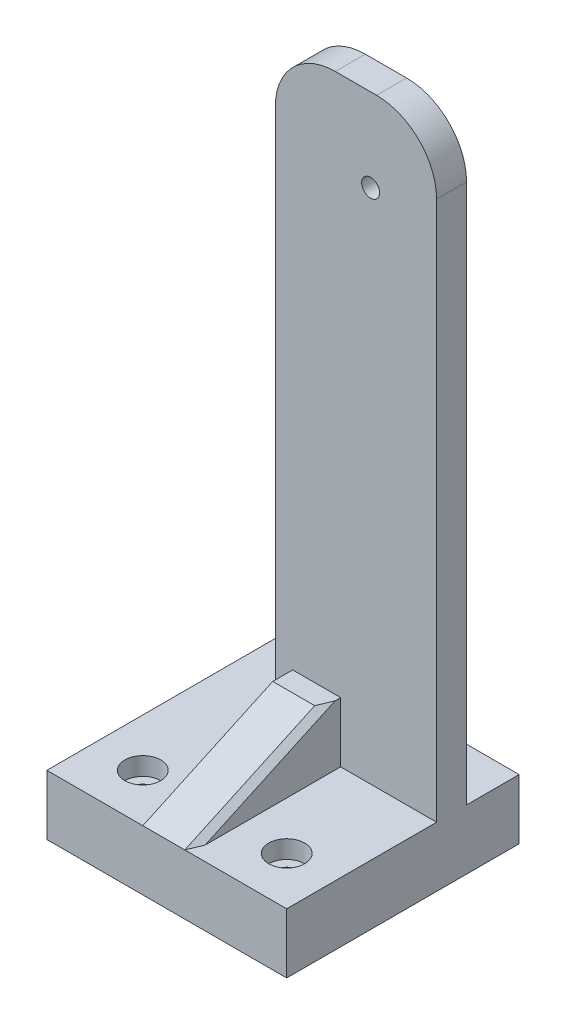
ISO-10303-21;
HEADER;
FILE_DESCRIPTION(('STEP AP214'),'2;1');
FILE_NAME('part.step','',(''),(''),'','','');
FILE_SCHEMA(('AUTOMOTIVE_DESIGN { 1 0 10303 214 1 1 1 1 }'));
ENDSEC;
DATA;
#1=APPLICATION_CONTEXT('core data for automotive mechanical design processes');
#2=APPLICATION_PROTOCOL_DEFINITION('international standard','automotive_design',2000,#1);
#3=PRODUCT_CONTEXT('',#1,'mechanical');
#4=PRODUCT('Part','Part','',(#3));
#5=PRODUCT_RELATED_PRODUCT_CATEGORY('part','',(#4));
#6=PRODUCT_DEFINITION_FORMATION('','',#4);
#7=PRODUCT_DEFINITION_CONTEXT('part definition',#1,'design');
#8=PRODUCT_DEFINITION('design','',#6,#7);
#9=PRODUCT_DEFINITION_SHAPE('','',#8);
#10=(LENGTH_UNIT() NAMED_UNIT(*) SI_UNIT(.MILLI.,.METRE.));
#11=(NAMED_UNIT(*) PLANE_ANGLE_UNIT() SI_UNIT($,.RADIAN.));
#12=(NAMED_UNIT(*) SI_UNIT($,.STERADIAN.) SOLID_ANGLE_UNIT());
#13=UNCERTAINTY_MEASURE_WITH_UNIT(LENGTH_MEASURE(1.E-05),#10,'distance_accuracy_value','');
#14=(GEOMETRIC_REPRESENTATION_CONTEXT(3) GLOBAL_UNCERTAINTY_ASSIGNED_CONTEXT((#13)) GLOBAL_UNIT_ASSIGNED_CONTEXT((#10,
#11,#12)) REPRESENTATION_CONTEXT('',''));
#15=CARTESIAN_POINT('',(0.,0.,0.));
#16=DIRECTION('',(0.,0.,1.));
#17=DIRECTION('',(1.,0.,0.));
#18=AXIS2_PLACEMENT_3D('',#15,#16,#17);
#19=CARTESIAN_POINT('',(-12.,-10.,-23.));
#20=DIRECTION('',(0.,1.,0.));
#21=DIRECTION('',(0.,0.,1.));
#22=AXIS2_PLACEMENT_3D('',#19,#20,#21);
#23=CYLINDRICAL_SURFACE('',#22,1.42);
#24=CARTESIAN_POINT('',(-12.,0.,-23.));
#25=DIRECTION('',(0.,1.,0.));
#26=DIRECTION('',(0.,0.,1.));
#27=AXIS2_PLACEMENT_3D('',#24,#25,#26);
#28=CIRCLE('',#27,1.42);
#29=CARTESIAN_POINT('',(-12.,0.,-21.58));
#30=VERTEX_POINT('',#29);
#31=EDGE_CURVE('E332',#30,#30,#28,.T.);
#32=ORIENTED_EDGE('',*,*,#31,.F.);
#33=EDGE_LOOP('',(#32));
#34=FACE_BOUND('',#33,.T.);
#35=CARTESIAN_POINT('',(-12.,7.,-23.));
#36=DIRECTION('',(0.,1.,0.));
#37=DIRECTION('',(0.,0.,1.));
#38=AXIS2_PLACEMENT_3D('',#35,#36,#37);
#39=CIRCLE('',#38,1.42);
#40=CARTESIAN_POINT('',(-12.,7.,-21.58));
#41=VERTEX_POINT('',#40);
#42=EDGE_CURVE('E344',#41,#41,#39,.F.);
#43=ORIENTED_EDGE('',*,*,#42,.F.);
#44=EDGE_LOOP('',(#43));
#45=FACE_BOUND('',#44,.T.);
#46=ADVANCED_FACE('F39',(#34,#45),#23,.F.);
#47=CARTESIAN_POINT('',(12.,-10.,7.));
#48=DIRECTION('',(0.,1.,0.));
#49=DIRECTION('',(0.,0.,1.));
#50=AXIS2_PLACEMENT_3D('',#47,#48,#49);
#51=CYLINDRICAL_SURFACE('',#50,1.42);
#52=CARTESIAN_POINT('',(12.,0.,7.));
#53=DIRECTION('',(0.,1.,0.));
#54=DIRECTION('',(0.,0.,1.));
#55=AXIS2_PLACEMENT_3D('',#52,#53,#54);
#56=CIRCLE('',#55,1.42);
#57=CARTESIAN_POINT('',(12.,0.,8.42));
#58=VERTEX_POINT('',#57);
#59=EDGE_CURVE('E331',#58,#58,#56,.T.);
#60=ORIENTED_EDGE('',*,*,#59,.F.);
#61=EDGE_LOOP('',(#60));
#62=FACE_BOUND('',#61,.T.);
#63=CARTESIAN_POINT('',(12.,7.,7.));
#64=DIRECTION('',(0.,1.,0.));
#65=DIRECTION('',(0.,0.,1.));
#66=AXIS2_PLACEMENT_3D('',#63,#64,#65);
#67=CIRCLE('',#66,1.42);
#68=CARTESIAN_POINT('',(12.,7.,8.42));
#69=VERTEX_POINT('',#68);
#70=EDGE_CURVE('E341',#69,#69,#67,.F.);
#71=ORIENTED_EDGE('',*,*,#70,.F.);
#72=EDGE_LOOP('',(#71));
#73=FACE_BOUND('',#72,.T.);
#74=ADVANCED_FACE('F520',(#62,#73),#51,.F.);
#75=CARTESIAN_POINT('',(-12.,-10.,7.));
#76=DIRECTION('',(0.,1.,0.));
#77=DIRECTION('',(0.,0.,1.));
#78=AXIS2_PLACEMENT_3D('',#75,#76,#77);
#79=CYLINDRICAL_SURFACE('',#78,1.42);
#80=CARTESIAN_POINT('',(-12.,0.,7.));
#81=DIRECTION('',(0.,1.,0.));
#82=DIRECTION('',(0.,0.,1.));
#83=AXIS2_PLACEMENT_3D('',#80,#81,#82);
#84=CIRCLE('',#83,1.42);
#85=CARTESIAN_POINT('',(-12.,0.,8.42));
#86=VERTEX_POINT('',#85);
#87=EDGE_CURVE('E328',#86,#86,#84,.T.);
#88=ORIENTED_EDGE('',*,*,#87,.F.);
#89=EDGE_LOOP('',(#88));
#90=FACE_BOUND('',#89,.T.);
#91=CARTESIAN_POINT('',(-12.,7.,7.));
#92=DIRECTION('',(0.,1.,0.));
#93=DIRECTION('',(0.,0.,1.));
#94=AXIS2_PLACEMENT_3D('',#91,#92,#93);
#95=CIRCLE('',#94,1.42);
#96=CARTESIAN_POINT('',(-12.,7.,8.42));
#97=VERTEX_POINT('',#96);
#98=EDGE_CURVE('E335',#97,#97,#95,.F.);
#99=ORIENTED_EDGE('',*,*,#98,.F.);
#100=EDGE_LOOP('',(#99));
#101=FACE_BOUND('',#100,.T.);
#102=ADVANCED_FACE('F516',(#90,#101),#79,.F.);
#103=CARTESIAN_POINT('',(0.,10.,0.));
#104=DIRECTION('',(0.,1.,0.));
#105=DIRECTION('',(0.,0.,1.));
#106=AXIS2_PLACEMENT_3D('',#103,#104,#105);
#107=PLANE('',#106);
#108=CARTESIAN_POINT('',(-12.,10.,-23.));
#109=DIRECTION('',(0.,1.,0.));
#110=DIRECTION('',(0.,0.,1.));
#111=AXIS2_PLACEMENT_3D('',#108,#109,#110);
#112=CIRCLE('',#111,3.);
#113=CARTESIAN_POINT('',(-12.,10.,-20.));
#114=VERTEX_POINT('',#113);
#115=EDGE_CURVE('E481',#114,#114,#112,.T.);
#116=ORIENTED_EDGE('',*,*,#115,.F.);
#117=EDGE_LOOP('',(#116));
#118=FACE_BOUND('',#117,.T.);
#119=CARTESIAN_POINT('',(-12.,10.,7.));
#120=DIRECTION('',(0.,1.,0.));
#121=DIRECTION('',(0.,0.,1.));
#122=AXIS2_PLACEMENT_3D('',#119,#120,#121);
#123=CIRCLE('',#122,3.);
#124=CARTESIAN_POINT('',(-12.,10.,10.));
#125=VERTEX_POINT('',#124);
#126=EDGE_CURVE('E348',#125,#125,#123,.T.);
#127=ORIENTED_EDGE('',*,*,#126,.F.);
#128=EDGE_LOOP('',(#127));
#129=FACE_BOUND('',#128,.T.);
#130=DIRECTION('',(1.,0.,0.));
#131=VECTOR('',#130,1.);
#132=CARTESIAN_POINT('',(0.,10.,-15.));
#133=LINE('',#132,#131);
#134=CARTESIAN_POINT('',(-6.88873999040141,10.,-15.));
#135=VERTEX_POINT('',#134);
#136=CARTESIAN_POINT('',(-4.,10.,-15.));
#137=VERTEX_POINT('',#136);
#138=EDGE_CURVE('E227',#135,#137,#133,.T.);
#139=ORIENTED_EDGE('',*,*,#138,.T.);
#140=DIRECTION('',(0.,0.,1.));
#141=VECTOR('',#140,1.);
#142=CARTESIAN_POINT('',(-4.,10.,-15.));
#143=LINE('',#142,#141);
#144=CARTESIAN_POINT('',(-4.,10.,-28.9478603318783));
#145=VERTEX_POINT('',#144);
#146=EDGE_CURVE('E207',#145,#137,#143,.T.);
#147=ORIENTED_EDGE('',*,*,#146,.F.);
#148=DIRECTION('',(-0.688918663769056,0.,0.724838654260835));
#149=VECTOR('',#148,1.);
#150=CARTESIAN_POINT('',(-3.00000000000003,10.,-30.));
#151=LINE('',#150,#149);
#152=CARTESIAN_POINT('',(-3.00000000000003,10.,-30.));
#153=VERTEX_POINT('',#152);
#154=EDGE_CURVE('E381',#145,#153,#151,.F.);
#155=ORIENTED_EDGE('',*,*,#154,.T.);
#156=DIRECTION('',(1.,0.,0.));
#157=VECTOR('',#156,1.);
#158=CARTESIAN_POINT('',(0.,10.,-30.));
#159=LINE('',#158,#157);
#160=CARTESIAN_POINT('',(-20.,10.,-30.));
#161=VERTEX_POINT('',#160);
#162=EDGE_CURVE('E237',#161,#153,#159,.T.);
#163=ORIENTED_EDGE('',*,*,#162,.F.);
#164=DIRECTION('',(0.,0.,-1.));
#165=VECTOR('',#164,1.);
#166=CARTESIAN_POINT('',(-20.,10.,0.));
#167=LINE('',#166,#165);
#168=CARTESIAN_POINT('',(-20.,10.,15.));
#169=VERTEX_POINT('',#168);
#170=EDGE_CURVE('E307',#169,#161,#167,.T.);
#171=ORIENTED_EDGE('',*,*,#170,.F.);
#172=DIRECTION('',(1.,0.,0.));
#173=VECTOR('',#172,1.);
#174=CARTESIAN_POINT('',(0.,10.,15.));
#175=LINE('',#174,#173);
#176=CARTESIAN_POINT('',(-4.,10.,15.));
#177=VERTEX_POINT('',#176);
#178=EDGE_CURVE('E310',#169,#177,#175,.T.);
#179=ORIENTED_EDGE('',*,*,#178,.T.);
#180=DIRECTION('',(0.,0.,1.));
#181=VECTOR('',#180,1.);
#182=CARTESIAN_POINT('',(-4.,10.,-10.));
#183=LINE('',#182,#181);
#184=CARTESIAN_POINT('',(-4.,10.,-10.));
#185=VERTEX_POINT('',#184);
#186=EDGE_CURVE('E261',#185,#177,#183,.T.);
#187=ORIENTED_EDGE('',*,*,#186,.F.);
#188=DIRECTION('',(1.,0.,0.));
#189=VECTOR('',#188,1.);
#190=CARTESIAN_POINT('',(-6.88873999040141,10.,-10.));
#191=LINE('',#190,#189);
#192=CARTESIAN_POINT('',(-6.88873999040141,10.,-10.));
#193=VERTEX_POINT('',#192);
#194=EDGE_CURVE('E289',#193,#185,#191,.T.);
#195=ORIENTED_EDGE('',*,*,#194,.F.);
#196=DIRECTION('',(0.,0.,1.));
#197=VECTOR('',#196,1.);
#198=CARTESIAN_POINT('',(-6.88873999040141,10.,-15.));
#199=LINE('',#198,#197);
#200=EDGE_CURVE('E284',#135,#193,#199,.T.);
#201=ORIENTED_EDGE('',*,*,#200,.F.);
#202=EDGE_LOOP('',(#139,#147,#155,#163,#171,#179,#187,#195,#201));
#203=FACE_BOUND('',#202,.T.);
#204=ADVANCED_FACE('F410',(#118,#129,#203),#107,.T.);
#205=DIRECTION('',(-1.,0.,0.));
#206=VECTOR('',#205,1.);
#207=CARTESIAN_POINT('',(0.,10.,-23.768276438247));
#208=LINE('',#207,#206);
#209=CARTESIAN_POINT('',(20.,10.,-23.768276438247));
#210=VERTEX_POINT('',#209);
#211=CARTESIAN_POINT('',(4.,10.,-23.768276438247));
#212=VERTEX_POINT('',#211);
#213=EDGE_CURVE('E233',#210,#212,#208,.T.);
#214=ORIENTED_EDGE('',*,*,#213,.T.);
#215=DIRECTION('',(0.,0.,-1.));
#216=VECTOR('',#215,1.);
#217=CARTESIAN_POINT('',(4.,10.,-15.));
#218=LINE('',#217,#216);
#219=CARTESIAN_POINT('',(4.,10.,-15.));
#220=VERTEX_POINT('',#219);
#221=EDGE_CURVE('E201',#220,#212,#218,.T.);
#222=ORIENTED_EDGE('',*,*,#221,.F.);
#223=CARTESIAN_POINT('',(20.,10.,-15.));
#224=VERTEX_POINT('',#223);
#225=EDGE_CURVE('E230',#220,#224,#133,.T.);
#226=ORIENTED_EDGE('',*,*,#225,.T.);
#227=DIRECTION('',(0.,0.,-1.));
#228=VECTOR('',#227,1.);
#229=CARTESIAN_POINT('',(20.,10.,0.));
#230=LINE('',#229,#228);
#231=EDGE_CURVE('E231',#224,#210,#230,.T.);
#232=ORIENTED_EDGE('',*,*,#231,.T.);
#233=EDGE_LOOP('',(#214,#222,#226,#232));
#234=FACE_BOUND('',#233,.T.);
#235=ADVANCED_FACE('F461',(#234),#107,.T.);
#236=CARTESIAN_POINT('',(0.,10.,-15.));
#237=DIRECTION('',(0.,0.,-1.));
#238=DIRECTION('',(-1.,0.,0.));
#239=AXIS2_PLACEMENT_3D('',#236,#237,#238);
#240=PLANE('',#239);
#241=CARTESIAN_POINT('',(8.99999999999999,96.14,-15.));
#242=DIRECTION('',(0.,0.,-1.));
#243=DIRECTION('',(-1.,0.,0.));
#244=AXIS2_PLACEMENT_3D('',#241,#242,#243);
#245=CIRCLE('',#244,1.5);
#246=CARTESIAN_POINT('',(7.49999999999999,96.14,-15.));
#247=VERTEX_POINT('',#246);
#248=EDGE_CURVE('E281',#247,#247,#245,.T.);
#249=ORIENTED_EDGE('',*,*,#248,.F.);
#250=EDGE_LOOP('',(#249));
#251=FACE_BOUND('',#250,.T.);
#252=DIRECTION('',(-1.,0.,0.));
#253=VECTOR('',#252,1.);
#254=CARTESIAN_POINT('',(-6.88873999040141,110.,-15.));
#255=LINE('',#254,#253);
#256=CARTESIAN_POINT('',(9.99999999999999,110.,-15.));
#257=VERTEX_POINT('',#256);
#258=CARTESIAN_POINT('',(3.11126000959859,110.,-15.));
#259=VERTEX_POINT('',#258);
#260=EDGE_CURVE('E288',#257,#259,#255,.T.);
#261=ORIENTED_EDGE('',*,*,#260,.F.);
#262=CARTESIAN_POINT('',(9.99999999999999,100.,-15.));
#263=DIRECTION('',(0.,0.,-1.));
#264=DIRECTION('',(-1.,0.,0.));
#265=AXIS2_PLACEMENT_3D('',#262,#263,#264);
#266=CIRCLE('',#265,10.);
#267=CARTESIAN_POINT('',(20.,100.,-15.));
#268=VERTEX_POINT('',#267);
#269=EDGE_CURVE('E356',#257,#268,#266,.T.);
#270=ORIENTED_EDGE('',*,*,#269,.T.);
#271=DIRECTION('',(0.,-1.,0.));
#272=VECTOR('',#271,1.);
#273=CARTESIAN_POINT('',(20.,10.,-15.));
#274=LINE('',#273,#272);
#275=EDGE_CURVE('E322',#268,#224,#274,.T.);
#276=ORIENTED_EDGE('',*,*,#275,.T.);
#277=ORIENTED_EDGE('',*,*,#225,.F.);
#278=DIRECTION('',(0.,-1.,0.));
#279=VECTOR('',#278,1.);
#280=CARTESIAN_POINT('',(4.,40.,-15.));
#281=LINE('',#280,#279);
#282=CARTESIAN_POINT('',(4.,40.,-15.));
#283=VERTEX_POINT('',#282);
#284=EDGE_CURVE('E212',#283,#220,#281,.T.);
#285=ORIENTED_EDGE('',*,*,#284,.F.);
#286=DIRECTION('',(1.,0.,0.));
#287=VECTOR('',#286,1.);
#288=CARTESIAN_POINT('',(-4.,40.,-15.));
#289=LINE('',#288,#287);
#290=CARTESIAN_POINT('',(-4.,40.,-15.));
#291=VERTEX_POINT('',#290);
#292=EDGE_CURVE('E195',#291,#283,#289,.T.);
#293=ORIENTED_EDGE('',*,*,#292,.F.);
#294=DIRECTION('',(0.,-1.,0.));
#295=VECTOR('',#294,1.);
#296=CARTESIAN_POINT('',(-4.,40.,-15.));
#297=LINE('',#296,#295);
#298=EDGE_CURVE('E204',#291,#137,#297,.T.);
#299=ORIENTED_EDGE('',*,*,#298,.T.);
#300=ORIENTED_EDGE('',*,*,#138,.F.);
#301=DIRECTION('',(0.,-1.,0.));
#302=VECTOR('',#301,1.);
#303=CARTESIAN_POINT('',(-6.88873999040141,110.,-15.));
#304=LINE('',#303,#302);
#305=CARTESIAN_POINT('',(-6.88873999040141,100.,-15.));
#306=VERTEX_POINT('',#305);
#307=EDGE_CURVE('E292',#306,#135,#304,.T.);
#308=ORIENTED_EDGE('',*,*,#307,.F.);
#309=CARTESIAN_POINT('',(3.11126000959859,100.,-15.));
#310=DIRECTION('',(0.,0.,-1.));
#311=DIRECTION('',(-1.,0.,0.));
#312=AXIS2_PLACEMENT_3D('',#309,#310,#311);
#313=CIRCLE('',#312,10.);
#314=EDGE_CURVE('E354',#306,#259,#313,.T.);
#315=ORIENTED_EDGE('',*,*,#314,.T.);
#316=EDGE_LOOP('',(#261,#270,#276,#277,#285,#293,#299,#300,#308,#315));
#317=FACE_BOUND('',#316,.T.);
#318=ADVANCED_FACE('F216',(#251,#317),#240,.T.);
#319=CARTESIAN_POINT('',(12.,10.,7.));
#320=DIRECTION('',(0.,1.,0.));
#321=DIRECTION('',(0.,0.,1.));
#322=AXIS2_PLACEMENT_3D('',#319,#320,#321);
#323=CIRCLE('',#322,3.);
#324=CARTESIAN_POINT('',(12.,10.,10.));
#325=VERTEX_POINT('',#324);
#326=EDGE_CURVE('E487',#325,#325,#323,.T.);
#327=ORIENTED_EDGE('',*,*,#326,.F.);
#328=EDGE_LOOP('',(#327));
#329=FACE_BOUND('',#328,.T.);
#330=CARTESIAN_POINT('',(3.99999999999999,10.,-10.));
#331=VERTEX_POINT('',#330);
#332=CARTESIAN_POINT('',(20.,10.,-10.));
#333=VERTEX_POINT('',#332);
#334=EDGE_CURVE('E295',#331,#333,#191,.T.);
#335=ORIENTED_EDGE('',*,*,#334,.F.);
#336=DIRECTION('',(0.,0.,-1.));
#337=VECTOR('',#336,1.);
#338=CARTESIAN_POINT('',(3.99999999999999,10.,-10.));
#339=LINE('',#338,#337);
#340=CARTESIAN_POINT('',(3.99999999999999,10.,12.6131205518055));
#341=VERTEX_POINT('',#340);
#342=EDGE_CURVE('E266',#341,#331,#339,.T.);
#343=ORIENTED_EDGE('',*,*,#342,.F.);
#344=DIRECTION('',(0.386414643912206,0.,-0.92232517203544));
#345=VECTOR('',#344,1.);
#346=CARTESIAN_POINT('',(12.0005044842077,10.,-6.48311917673791));
#347=LINE('',#346,#345);
#348=CARTESIAN_POINT('',(2.99999999999998,10.,15.));
#349=VERTEX_POINT('',#348);
#350=EDGE_CURVE('E11',#341,#349,#347,.F.);
#351=ORIENTED_EDGE('',*,*,#350,.T.);
#352=CARTESIAN_POINT('',(20.,10.,15.));
#353=VERTEX_POINT('',#352);
#354=EDGE_CURVE('E62',#349,#353,#175,.T.);
#355=ORIENTED_EDGE('',*,*,#354,.T.);
#356=DIRECTION('',(0.,0.,-1.));
#357=VECTOR('',#356,1.);
#358=CARTESIAN_POINT('',(20.,10.,0.));
#359=LINE('',#358,#357);
#360=EDGE_CURVE('E304',#353,#333,#359,.T.);
#361=ORIENTED_EDGE('',*,*,#360,.T.);
#362=EDGE_LOOP('',(#335,#343,#351,#355,#361));
#363=FACE_BOUND('',#362,.T.);
#364=ADVANCED_FACE('F400',(#329,#363),#107,.T.);
#365=CARTESIAN_POINT('',(-6.88873999040141,110.,-10.));
#366=DIRECTION('',(0.,0.,-1.));
#367=DIRECTION('',(-1.,0.,0.));
#368=AXIS2_PLACEMENT_3D('',#365,#366,#367);
#369=PLANE('',#368);
#370=CARTESIAN_POINT('',(8.99999999999999,96.14,-10.));
#371=DIRECTION('',(0.,0.,1.));
#372=DIRECTION('',(1.,0.,0.));
#373=AXIS2_PLACEMENT_3D('',#370,#371,#372);
#374=CIRCLE('',#373,1.5);
#375=CARTESIAN_POINT('',(10.5,96.14,-10.));
#376=VERTEX_POINT('',#375);
#377=EDGE_CURVE('E278',#376,#376,#374,.T.);
#378=ORIENTED_EDGE('',*,*,#377,.F.);
#379=EDGE_LOOP('',(#378));
#380=FACE_BOUND('',#379,.T.);
#381=DIRECTION('',(0.,-1.,0.));
#382=VECTOR('',#381,1.);
#383=CARTESIAN_POINT('',(20.,110.,-10.));
#384=LINE('',#383,#382);
#385=CARTESIAN_POINT('',(20.,100.,-10.));
#386=VERTEX_POINT('',#385);
#387=EDGE_CURVE('E299',#386,#333,#384,.T.);
#388=ORIENTED_EDGE('',*,*,#387,.F.);
#389=CARTESIAN_POINT('',(9.99999999999999,100.,-10.));
#390=DIRECTION('',(0.,0.,-1.));
#391=DIRECTION('',(-1.,0.,0.));
#392=AXIS2_PLACEMENT_3D('',#389,#390,#391);
#393=CIRCLE('',#392,10.);
#394=CARTESIAN_POINT('',(9.99999999999999,110.,-10.));
#395=VERTEX_POINT('',#394);
#396=EDGE_CURVE('E362',#386,#395,#393,.F.);
#397=ORIENTED_EDGE('',*,*,#396,.T.);
#398=DIRECTION('',(1.,0.,0.));
#399=VECTOR('',#398,1.);
#400=CARTESIAN_POINT('',(-6.88873999040141,110.,-10.));
#401=LINE('',#400,#399);
#402=CARTESIAN_POINT('',(3.11126000959859,110.,-10.));
#403=VERTEX_POINT('',#402);
#404=EDGE_CURVE('E285',#403,#395,#401,.T.);
#405=ORIENTED_EDGE('',*,*,#404,.F.);
#406=CARTESIAN_POINT('',(3.11126000959859,100.,-10.));
#407=DIRECTION('',(0.,0.,-1.));
#408=DIRECTION('',(-1.,0.,0.));
#409=AXIS2_PLACEMENT_3D('',#406,#407,#408);
#410=CIRCLE('',#409,10.);
#411=CARTESIAN_POINT('',(-6.88873999040141,100.,-10.));
#412=VERTEX_POINT('',#411);
#413=EDGE_CURVE('E360',#403,#412,#410,.F.);
#414=ORIENTED_EDGE('',*,*,#413,.T.);
#415=DIRECTION('',(0.,-1.,0.));
#416=VECTOR('',#415,1.);
#417=CARTESIAN_POINT('',(-6.88873999040141,110.,-10.));
#418=LINE('',#417,#416);
#419=EDGE_CURVE('E301',#412,#193,#418,.T.);
#420=ORIENTED_EDGE('',*,*,#419,.T.);
#421=ORIENTED_EDGE('',*,*,#194,.T.);
#422=DIRECTION('',(0.,-1.,0.));
#423=VECTOR('',#422,1.);
#424=CARTESIAN_POINT('',(-4.,20.,-10.));
#425=LINE('',#424,#423);
#426=CARTESIAN_POINT('',(-4.,20.,-10.));
#427=VERTEX_POINT('',#426);
#428=EDGE_CURVE('E270',#427,#185,#425,.T.);
#429=ORIENTED_EDGE('',*,*,#428,.F.);
#430=DIRECTION('',(-1.,0.,0.));
#431=VECTOR('',#430,1.);
#432=CARTESIAN_POINT('',(-4.,20.,-10.));
#433=LINE('',#432,#431);
#434=CARTESIAN_POINT('',(3.99999999999999,20.,-10.));
#435=VERTEX_POINT('',#434);
#436=EDGE_CURVE('E268',#435,#427,#433,.T.);
#437=ORIENTED_EDGE('',*,*,#436,.F.);
#438=DIRECTION('',(0.,-1.,0.));
#439=VECTOR('',#438,1.);
#440=CARTESIAN_POINT('',(3.99999999999999,20.,-10.));
#441=LINE('',#440,#439);
#442=EDGE_CURVE('E275',#435,#331,#441,.T.);
#443=ORIENTED_EDGE('',*,*,#442,.T.);
#444=ORIENTED_EDGE('',*,*,#334,.T.);
#445=EDGE_LOOP('',(#388,#397,#405,#414,#420,#421,#429,#437,#443,#444));
#446=FACE_BOUND('',#445,.T.);
#447=ADVANCED_FACE('F433',(#380,#446),#369,.F.);
#448=CARTESIAN_POINT('',(20.,10.,0.));
#449=DIRECTION('',(-1.,0.,0.));
#450=DIRECTION('',(0.,0.,1.));
#451=AXIS2_PLACEMENT_3D('',#448,#449,#450);
#452=PLANE('',#451);
#453=ORIENTED_EDGE('',*,*,#275,.F.);
#454=DIRECTION('',(0.,0.,-1.));
#455=VECTOR('',#454,1.);
#456=CARTESIAN_POINT('',(20.,100.,-10.));
#457=LINE('',#456,#455);
#458=EDGE_CURVE('E358',#268,#386,#457,.F.);
#459=ORIENTED_EDGE('',*,*,#458,.T.);
#460=ORIENTED_EDGE('',*,*,#387,.T.);
#461=ORIENTED_EDGE('',*,*,#360,.F.);
#462=DIRECTION('',(0.,-1.,0.));
#463=VECTOR('',#462,1.);
#464=CARTESIAN_POINT('',(20.,10.,15.));
#465=LINE('',#464,#463);
#466=CARTESIAN_POINT('',(20.,0.,15.));
#467=VERTEX_POINT('',#466);
#468=EDGE_CURVE('E313',#353,#467,#465,.T.);
#469=ORIENTED_EDGE('',*,*,#468,.T.);
#470=DIRECTION('',(0.,0.,-1.));
#471=VECTOR('',#470,1.);
#472=CARTESIAN_POINT('',(20.,0.,0.));
#473=LINE('',#472,#471);
#474=CARTESIAN_POINT('',(20.,0.,-23.768276438247));
#475=VERTEX_POINT('',#474);
#476=EDGE_CURVE('E303',#467,#475,#473,.T.);
#477=ORIENTED_EDGE('',*,*,#476,.T.);
#478=DIRECTION('',(0.,-1.,0.));
#479=VECTOR('',#478,1.);
#480=CARTESIAN_POINT('',(20.,10.,-23.768276438247));
#481=LINE('',#480,#479);
#482=EDGE_CURVE('E253',#210,#475,#481,.T.);
#483=ORIENTED_EDGE('',*,*,#482,.F.);
#484=ORIENTED_EDGE('',*,*,#231,.F.);
#485=EDGE_LOOP('',(#453,#459,#460,#461,#469,#477,#483,#484));
#486=FACE_BOUND('',#485,.T.);
#487=ADVANCED_FACE('F428',(#486),#452,.F.);
#488=CARTESIAN_POINT('',(-20.,10.,0.));
#489=DIRECTION('',(-1.,0.,0.));
#490=DIRECTION('',(0.,0.,1.));
#491=AXIS2_PLACEMENT_3D('',#488,#489,#490);
#492=PLANE('',#491);
#493=DIRECTION('',(0.,0.,-1.));
#494=VECTOR('',#493,1.);
#495=CARTESIAN_POINT('',(-20.,0.,0.));
#496=LINE('',#495,#494);
#497=CARTESIAN_POINT('',(-20.,0.,15.));
#498=VERTEX_POINT('',#497);
#499=CARTESIAN_POINT('',(-20.,0.,-30.));
#500=VERTEX_POINT('',#499);
#501=EDGE_CURVE('E315',#498,#500,#496,.T.);
#502=ORIENTED_EDGE('',*,*,#501,.F.);
#503=DIRECTION('',(0.,-1.,0.));
#504=VECTOR('',#503,1.);
#505=CARTESIAN_POINT('',(-20.,10.,15.));
#506=LINE('',#505,#504);
#507=EDGE_CURVE('E320',#169,#498,#506,.T.);
#508=ORIENTED_EDGE('',*,*,#507,.F.);
#509=ORIENTED_EDGE('',*,*,#170,.T.);
#510=DIRECTION('',(0.,-1.,0.));
#511=VECTOR('',#510,1.);
#512=CARTESIAN_POINT('',(-20.,10.,-30.));
#513=LINE('',#512,#511);
#514=EDGE_CURVE('E239',#161,#500,#513,.T.);
#515=ORIENTED_EDGE('',*,*,#514,.T.);
#516=EDGE_LOOP('',(#502,#508,#509,#515));
#517=FACE_BOUND('',#516,.T.);
#518=ADVANCED_FACE('F414',(#517),#492,.T.);
#519=CARTESIAN_POINT('',(0.,10.,15.));
#520=DIRECTION('',(0.,0.,-1.));
#521=DIRECTION('',(-1.,0.,0.));
#522=AXIS2_PLACEMENT_3D('',#519,#520,#521);
#523=PLANE('',#522);
#524=ORIENTED_EDGE('',*,*,#354,.F.);
#525=DIRECTION('',(-1.,0.,0.));
#526=VECTOR('',#525,1.);
#527=CARTESIAN_POINT('',(31.,10.,15.));
#528=LINE('',#527,#526);
#529=EDGE_CURVE('E259',#349,#177,#528,.T.);
#530=ORIENTED_EDGE('',*,*,#529,.T.);
#531=ORIENTED_EDGE('',*,*,#178,.F.);
#532=ORIENTED_EDGE('',*,*,#507,.T.);
#533=DIRECTION('',(1.,0.,0.));
#534=VECTOR('',#533,1.);
#535=CARTESIAN_POINT('',(0.,0.,15.));
#536=LINE('',#535,#534);
#537=EDGE_CURVE('E308',#498,#467,#536,.T.);
#538=ORIENTED_EDGE('',*,*,#537,.T.);
#539=ORIENTED_EDGE('',*,*,#468,.F.);
#540=EDGE_LOOP('',(#524,#530,#531,#532,#538,#539));
#541=FACE_BOUND('',#540,.T.);
#542=ADVANCED_FACE('F404',(#541),#523,.F.);
#543=CARTESIAN_POINT('',(0.,0.,0.));
#544=DIRECTION('',(0.,1.,0.));
#545=DIRECTION('',(0.,0.,1.));
#546=AXIS2_PLACEMENT_3D('',#543,#544,#545);
#547=PLANE('',#546);
#548=ORIENTED_EDGE('',*,*,#59,.T.);
#549=EDGE_LOOP('',(#548));
#550=FACE_BOUND('',#549,.T.);
#551=ORIENTED_EDGE('',*,*,#31,.T.);
#552=EDGE_LOOP('',(#551));
#553=FACE_BOUND('',#552,.T.);
#554=ORIENTED_EDGE('',*,*,#87,.T.);
#555=EDGE_LOOP('',(#554));
#556=FACE_BOUND('',#555,.T.);
#557=ORIENTED_EDGE('',*,*,#476,.F.);
#558=ORIENTED_EDGE('',*,*,#537,.F.);
#559=ORIENTED_EDGE('',*,*,#501,.T.);
#560=DIRECTION('',(1.,0.,0.));
#561=VECTOR('',#560,1.);
#562=CARTESIAN_POINT('',(0.,0.,-30.));
#563=LINE('',#562,#561);
#564=CARTESIAN_POINT('',(4.,0.,-30.));
#565=VERTEX_POINT('',#564);
#566=EDGE_CURVE('E234',#500,#565,#563,.T.);
#567=ORIENTED_EDGE('',*,*,#566,.T.);
#568=DIRECTION('',(0.,0.,-1.));
#569=VECTOR('',#568,1.);
#570=CARTESIAN_POINT('',(4.,0.,0.));
#571=LINE('',#570,#569);
#572=CARTESIAN_POINT('',(4.,0.,-23.768276438247));
#573=VERTEX_POINT('',#572);
#574=EDGE_CURVE('E241',#573,#565,#571,.T.);
#575=ORIENTED_EDGE('',*,*,#574,.F.);
#576=DIRECTION('',(-1.,0.,0.));
#577=VECTOR('',#576,1.);
#578=CARTESIAN_POINT('',(0.,0.,-23.768276438247));
#579=LINE('',#578,#577);
#580=EDGE_CURVE('E211',#475,#573,#579,.T.);
#581=ORIENTED_EDGE('',*,*,#580,.F.);
#582=EDGE_LOOP('',(#557,#558,#559,#567,#575,#581));
#583=FACE_BOUND('',#582,.T.);
#584=ADVANCED_FACE('F423',(#550,#553,#556,#583),#547,.F.);
#585=CARTESIAN_POINT('',(-6.88873999040141,110.,-15.));
#586=DIRECTION('',(1.,0.,0.));
#587=DIRECTION('',(0.,0.,-1.));
#588=AXIS2_PLACEMENT_3D('',#585,#586,#587);
#589=PLANE('',#588);
#590=ORIENTED_EDGE('',*,*,#419,.F.);
#591=DIRECTION('',(0.,0.,1.));
#592=VECTOR('',#591,1.);
#593=CARTESIAN_POINT('',(-6.88873999040141,100.,-15.));
#594=LINE('',#593,#592);
#595=EDGE_CURVE('E364',#412,#306,#594,.F.);
#596=ORIENTED_EDGE('',*,*,#595,.T.);
#597=ORIENTED_EDGE('',*,*,#307,.T.);
#598=ORIENTED_EDGE('',*,*,#200,.T.);
#599=EDGE_LOOP('',(#590,#596,#597,#598));
#600=FACE_BOUND('',#599,.T.);
#601=ADVANCED_FACE('F445',(#600),#589,.F.);
#602=CARTESIAN_POINT('',(0.,110.,0.));
#603=DIRECTION('',(0.,1.,0.));
#604=DIRECTION('',(0.,0.,1.));
#605=AXIS2_PLACEMENT_3D('',#602,#603,#604);
#606=PLANE('',#605);
#607=ORIENTED_EDGE('',*,*,#404,.T.);
#608=DIRECTION('',(0.,0.,-1.));
#609=VECTOR('',#608,1.);
#610=CARTESIAN_POINT('',(9.99999999999999,110.,-15.));
#611=LINE('',#610,#609);
#612=EDGE_CURVE('E351',#395,#257,#611,.T.);
#613=ORIENTED_EDGE('',*,*,#612,.T.);
#614=ORIENTED_EDGE('',*,*,#260,.T.);
#615=DIRECTION('',(0.,0.,1.));
#616=VECTOR('',#615,1.);
#617=CARTESIAN_POINT('',(3.11126000959859,110.,-10.));
#618=LINE('',#617,#616);
#619=EDGE_CURVE('E327',#259,#403,#618,.T.);
#620=ORIENTED_EDGE('',*,*,#619,.T.);
#621=EDGE_LOOP('',(#607,#613,#614,#620));
#622=FACE_BOUND('',#621,.T.);
#623=ADVANCED_FACE('F452',(#622),#606,.T.);
#624=CARTESIAN_POINT('',(8.99999999999999,96.14,-40.));
#625=DIRECTION('',(0.,0.,1.));
#626=DIRECTION('',(1.,0.,0.));
#627=AXIS2_PLACEMENT_3D('',#624,#625,#626);
#628=CYLINDRICAL_SURFACE('',#627,1.5);
#629=ORIENTED_EDGE('',*,*,#248,.T.);
#630=EDGE_LOOP('',(#629));
#631=FACE_BOUND('',#630,.T.);
#632=ORIENTED_EDGE('',*,*,#377,.T.);
#633=EDGE_LOOP('',(#632));
#634=FACE_BOUND('',#633,.T.);
#635=ADVANCED_FACE('F558',(#631,#634),#628,.F.);
#636=CARTESIAN_POINT('',(-4.,20.,-10.));
#637=DIRECTION('',(1.,0.,0.));
#638=DIRECTION('',(0.,0.,-1.));
#639=AXIS2_PLACEMENT_3D('',#636,#637,#638);
#640=PLANE('',#639);
#641=ORIENTED_EDGE('',*,*,#186,.T.);
#642=DIRECTION('',(0.,-0.418957061596232,0.908006046531988));
#643=VECTOR('',#642,1.);
#644=CARTESIAN_POINT('',(-4.,21.5350845734008,-10.));
#645=LINE('',#644,#643);
#646=CARTESIAN_POINT('',(-4.,20.,-6.67300971303536));
#647=VERTEX_POINT('',#646);
#648=EDGE_CURVE('E256',#647,#177,#645,.T.);
#649=ORIENTED_EDGE('',*,*,#648,.F.);
#650=DIRECTION('',(0.,0.,1.));
#651=VECTOR('',#650,1.);
#652=CARTESIAN_POINT('',(-4.,20.,-10.));
#653=LINE('',#652,#651);
#654=EDGE_CURVE('E262',#427,#647,#653,.T.);
#655=ORIENTED_EDGE('',*,*,#654,.F.);
#656=ORIENTED_EDGE('',*,*,#428,.T.);
#657=EDGE_LOOP('',(#641,#649,#655,#656));
#658=FACE_BOUND('',#657,.T.);
#659=ADVANCED_FACE('F438',(#658),#640,.F.);
#660=CARTESIAN_POINT('',(3.99999999999999,20.,-10.));
#661=DIRECTION('',(-1.,0.,0.));
#662=DIRECTION('',(0.,0.,1.));
#663=AXIS2_PLACEMENT_3D('',#660,#661,#662);
#664=PLANE('',#663);
#665=DIRECTION('',(0.,0.,-1.));
#666=VECTOR('',#665,1.);
#667=CARTESIAN_POINT('',(3.99999999999999,20.,-10.));
#668=LINE('',#667,#666);
#669=CARTESIAN_POINT('',(3.99999999999999,20.,-9.05988916122988));
#670=VERTEX_POINT('',#669);
#671=EDGE_CURVE('E265',#670,#435,#668,.T.);
#672=ORIENTED_EDGE('',*,*,#671,.F.);
#673=DIRECTION('',(0.,-0.418957061596232,0.908006046531988));
#674=VECTOR('',#673,1.);
#675=CARTESIAN_POINT('',(3.99999999999999,20.3576327772478,-9.83498702672905));
#676=LINE('',#675,#674);
#677=EDGE_CURVE('E384',#670,#341,#676,.T.);
#678=ORIENTED_EDGE('',*,*,#677,.T.);
#679=ORIENTED_EDGE('',*,*,#342,.T.);
#680=ORIENTED_EDGE('',*,*,#442,.F.);
#681=EDGE_LOOP('',(#672,#678,#679,#680));
#682=FACE_BOUND('',#681,.T.);
#683=ADVANCED_FACE('F395',(#682),#664,.F.);
#684=CARTESIAN_POINT('',(0.,20.,0.));
#685=DIRECTION('',(0.,1.,0.));
#686=DIRECTION('',(0.,0.,1.));
#687=AXIS2_PLACEMENT_3D('',#684,#685,#686);
#688=PLANE('',#687);
#689=DIRECTION('',(-1.,0.,0.));
#690=VECTOR('',#689,1.);
#691=CARTESIAN_POINT('',(0.,20.,-6.67300971303535));
#692=LINE('',#691,#690);
#693=CARTESIAN_POINT('',(2.99999999999998,20.,-6.67300971303535));
#694=VERTEX_POINT('',#693);
#695=EDGE_CURVE('E324',#694,#647,#692,.T.);
#696=ORIENTED_EDGE('',*,*,#695,.F.);
#697=DIRECTION('',(-0.386414643912206,0.,0.92232517203544));
#698=VECTOR('',#697,1.);
#699=CARTESIAN_POINT('',(0.17379082132781,20.,0.0728108918358948));
#700=LINE('',#699,#698);
#701=EDGE_CURVE('E47',#694,#670,#700,.F.);
#702=ORIENTED_EDGE('',*,*,#701,.T.);
#703=ORIENTED_EDGE('',*,*,#671,.T.);
#704=ORIENTED_EDGE('',*,*,#436,.T.);
#705=ORIENTED_EDGE('',*,*,#654,.T.);
#706=EDGE_LOOP('',(#696,#702,#703,#704,#705));
#707=FACE_BOUND('',#706,.T.);
#708=ADVANCED_FACE('F390',(#707),#688,.T.);
#709=CARTESIAN_POINT('',(31.,21.5350845734008,-10.));
#710=DIRECTION('',(0.,-0.908006046531988,-0.418957061596232));
#711=DIRECTION('',(0.,0.418957061596232,-0.908006046531988));
#712=AXIS2_PLACEMENT_3D('',#709,#710,#711);
#713=PLANE('',#712);
#714=ORIENTED_EDGE('',*,*,#529,.F.);
#715=DIRECTION('',(0.,0.418957061596232,-0.908006046531988));
#716=VECTOR('',#715,1.);
#717=CARTESIAN_POINT('',(2.99999999999998,21.5350845734008,-10.));
#718=LINE('',#717,#716);
#719=EDGE_CURVE('E54',#349,#694,#718,.T.);
#720=ORIENTED_EDGE('',*,*,#719,.T.);
#721=ORIENTED_EDGE('',*,*,#695,.T.);
#722=ORIENTED_EDGE('',*,*,#648,.T.);
#723=EDGE_LOOP('',(#714,#720,#721,#722));
#724=FACE_BOUND('',#723,.T.);
#725=ADVANCED_FACE('F401',(#724),#713,.F.);
#726=CARTESIAN_POINT('',(0.,10.,-23.768276438247));
#727=DIRECTION('',(0.,0.,1.));
#728=DIRECTION('',(1.,0.,0.));
#729=AXIS2_PLACEMENT_3D('',#726,#727,#728);
#730=PLANE('',#729);
#731=ORIENTED_EDGE('',*,*,#580,.T.);
#732=DIRECTION('',(0.,-1.,0.));
#733=VECTOR('',#732,1.);
#734=CARTESIAN_POINT('',(4.,10.,-23.768276438247));
#735=LINE('',#734,#733);
#736=EDGE_CURVE('E250',#212,#573,#735,.T.);
#737=ORIENTED_EDGE('',*,*,#736,.F.);
#738=ORIENTED_EDGE('',*,*,#213,.F.);
#739=ORIENTED_EDGE('',*,*,#482,.T.);
#740=EDGE_LOOP('',(#731,#737,#738,#739));
#741=FACE_BOUND('',#740,.T.);
#742=ADVANCED_FACE('F546',(#741),#730,.F.);
#743=CARTESIAN_POINT('',(4.,10.,0.));
#744=DIRECTION('',(-1.,0.,0.));
#745=DIRECTION('',(0.,0.,1.));
#746=AXIS2_PLACEMENT_3D('',#743,#744,#745);
#747=PLANE('',#746);
#748=DIRECTION('',(0.,-1.,0.));
#749=VECTOR('',#748,1.);
#750=CARTESIAN_POINT('',(4.,10.,-30.));
#751=LINE('',#750,#749);
#752=CARTESIAN_POINT('',(4.,6.78348333483153,-30.));
#753=VERTEX_POINT('',#752);
#754=EDGE_CURVE('E248',#753,#565,#751,.T.);
#755=ORIENTED_EDGE('',*,*,#754,.F.);
#756=DIRECTION('',(0.,0.950444157081552,0.310895326869895));
#757=VECTOR('',#756,1.);
#758=CARTESIAN_POINT('',(4.,18.5537640797536,-26.1498787148323));
#759=LINE('',#758,#757);
#760=CARTESIAN_POINT('',(4.,40.,-19.1347011508739));
#761=VERTEX_POINT('',#760);
#762=EDGE_CURVE('E366',#753,#761,#759,.T.);
#763=ORIENTED_EDGE('',*,*,#762,.T.);
#764=DIRECTION('',(0.,0.,-1.));
#765=VECTOR('',#764,1.);
#766=CARTESIAN_POINT('',(4.,40.,-15.));
#767=LINE('',#766,#765);
#768=EDGE_CURVE('E218',#283,#761,#767,.T.);
#769=ORIENTED_EDGE('',*,*,#768,.F.);
#770=ORIENTED_EDGE('',*,*,#284,.T.);
#771=ORIENTED_EDGE('',*,*,#221,.T.);
#772=ORIENTED_EDGE('',*,*,#736,.T.);
#773=ORIENTED_EDGE('',*,*,#574,.T.);
#774=EDGE_LOOP('',(#755,#763,#769,#770,#771,#772,#773));
#775=FACE_BOUND('',#774,.T.);
#776=ADVANCED_FACE('F465',(#775),#747,.F.);
#777=CARTESIAN_POINT('',(0.,10.,-30.));
#778=DIRECTION('',(0.,0.,-1.));
#779=DIRECTION('',(-1.,0.,0.));
#780=AXIS2_PLACEMENT_3D('',#777,#778,#779);
#781=PLANE('',#780);
#782=DIRECTION('',(-1.,0.,0.));
#783=VECTOR('',#782,1.);
#784=CARTESIAN_POINT('',(31.,10.,-30.));
#785=LINE('',#784,#783);
#786=CARTESIAN_POINT('',(2.99999999999998,10.,-30.));
#787=VERTEX_POINT('',#786);
#788=EDGE_CURVE('E224',#787,#153,#785,.T.);
#789=ORIENTED_EDGE('',*,*,#788,.F.);
#790=DIRECTION('',(-0.296878675342788,0.954915206773204,0.));
#791=VECTOR('',#790,1.);
#792=CARTESIAN_POINT('',(2.73558915638012,10.8504818849545,-30.));
#793=LINE('',#792,#791);
#794=EDGE_CURVE('E377',#787,#753,#793,.F.);
#795=ORIENTED_EDGE('',*,*,#794,.T.);
#796=ORIENTED_EDGE('',*,*,#754,.T.);
#797=ORIENTED_EDGE('',*,*,#566,.F.);
#798=ORIENTED_EDGE('',*,*,#514,.F.);
#799=ORIENTED_EDGE('',*,*,#162,.T.);
#800=EDGE_LOOP('',(#789,#795,#796,#797,#798,#799));
#801=FACE_BOUND('',#800,.T.);
#802=ADVANCED_FACE('F418',(#801),#781,.T.);
#803=CARTESIAN_POINT('',(-4.,40.,-15.));
#804=DIRECTION('',(1.,0.,0.));
#805=DIRECTION('',(0.,0.,-1.));
#806=AXIS2_PLACEMENT_3D('',#803,#804,#805);
#807=PLANE('',#806);
#808=DIRECTION('',(0.,0.,1.));
#809=VECTOR('',#808,1.);
#810=CARTESIAN_POINT('',(-4.,40.,-15.));
#811=LINE('',#810,#809);
#812=CARTESIAN_POINT('',(-4.,40.,-19.1347011508739));
#813=VERTEX_POINT('',#812);
#814=EDGE_CURVE('E190',#813,#291,#811,.T.);
#815=ORIENTED_EDGE('',*,*,#814,.F.);
#816=DIRECTION('',(0.,-0.950444157081552,-0.310895326869894));
#817=VECTOR('',#816,1.);
#818=CARTESIAN_POINT('',(-4.,41.2217572483557,-18.7350578722519));
#819=LINE('',#818,#817);
#820=EDGE_CURVE('E379',#813,#145,#819,.T.);
#821=ORIENTED_EDGE('',*,*,#820,.T.);
#822=ORIENTED_EDGE('',*,*,#146,.T.);
#823=ORIENTED_EDGE('',*,*,#298,.F.);
#824=EDGE_LOOP('',(#815,#821,#822,#823));
#825=FACE_BOUND('',#824,.T.);
#826=ADVANCED_FACE('F205',(#825),#807,.F.);
#827=CARTESIAN_POINT('',(0.,40.,0.));
#828=DIRECTION('',(0.,-1.,0.));
#829=DIRECTION('',(0.,0.,-1.));
#830=AXIS2_PLACEMENT_3D('',#827,#828,#829);
#831=PLANE('',#830);
#832=ORIENTED_EDGE('',*,*,#768,.T.);
#833=DIRECTION('',(0.688918663769061,0.,0.724838654260831));
#834=VECTOR('',#833,1.);
#835=CARTESIAN_POINT('',(0.496936869423484,40.,-22.820412830488));
#836=LINE('',#835,#834);
#837=CARTESIAN_POINT('',(2.99999999999998,40.,-20.1868408189956));
#838=VERTEX_POINT('',#837);
#839=EDGE_CURVE('E370',#761,#838,#836,.F.);
#840=ORIENTED_EDGE('',*,*,#839,.T.);
#841=DIRECTION('',(-1.,0.,0.));
#842=VECTOR('',#841,1.);
#843=CARTESIAN_POINT('',(0.,40.,-20.1868408189956));
#844=LINE('',#843,#842);
#845=CARTESIAN_POINT('',(-3.00000000000003,40.,-20.1868408189956));
#846=VERTEX_POINT('',#845);
#847=EDGE_CURVE('E229',#838,#846,#844,.T.);
#848=ORIENTED_EDGE('',*,*,#847,.T.);
#849=DIRECTION('',(0.688918663769056,0.,-0.724838654260835));
#850=VECTOR('',#849,1.);
#851=CARTESIAN_POINT('',(1.90024889720076,40.,-25.3425870674103));
#852=LINE('',#851,#850);
#853=EDGE_CURVE('E198',#846,#813,#852,.F.);
#854=ORIENTED_EDGE('',*,*,#853,.T.);
#855=ORIENTED_EDGE('',*,*,#814,.T.);
#856=ORIENTED_EDGE('',*,*,#292,.T.);
#857=EDGE_LOOP('',(#832,#840,#848,#854,#855,#856));
#858=FACE_BOUND('',#857,.T.);
#859=ADVANCED_FACE('F193',(#858),#831,.F.);
#860=CARTESIAN_POINT('',(31.,10.,-30.));
#861=DIRECTION('',(0.,-0.310895326869895,0.950444157081552));
#862=DIRECTION('',(0.,-0.950444157081552,-0.310895326869895));
#863=AXIS2_PLACEMENT_3D('',#860,#861,#862);
#864=PLANE('',#863);
#865=ORIENTED_EDGE('',*,*,#847,.F.);
#866=DIRECTION('',(0.,-0.950444157081552,-0.310895326869895));
#867=VECTOR('',#866,1.);
#868=CARTESIAN_POINT('',(2.99999999999998,10.,-30.));
#869=LINE('',#868,#867);
#870=EDGE_CURVE('E375',#838,#787,#869,.T.);
#871=ORIENTED_EDGE('',*,*,#870,.T.);
#872=ORIENTED_EDGE('',*,*,#788,.T.);
#873=DIRECTION('',(0.,0.950444157081552,0.310895326869895));
#874=VECTOR('',#873,1.);
#875=CARTESIAN_POINT('',(-3.00000000000003,10.,-30.));
#876=LINE('',#875,#874);
#877=EDGE_CURVE('E372',#153,#846,#876,.T.);
#878=ORIENTED_EDGE('',*,*,#877,.T.);
#879=EDGE_LOOP('',(#865,#871,#872,#878));
#880=FACE_BOUND('',#879,.T.);
#881=ADVANCED_FACE('F471',(#880),#864,.F.);
#882=CARTESIAN_POINT('',(-12.,7.,7.));
#883=DIRECTION('',(0.,1.,0.));
#884=DIRECTION('',(0.,0.,1.));
#885=AXIS2_PLACEMENT_3D('',#882,#883,#884);
#886=PLANE('',#885);
#887=CARTESIAN_POINT('',(-12.,7.,7.));
#888=DIRECTION('',(0.,1.,0.));
#889=DIRECTION('',(0.,0.,1.));
#890=AXIS2_PLACEMENT_3D('',#887,#888,#889);
#891=CIRCLE('',#890,3.);
#892=CARTESIAN_POINT('',(-12.,7.,10.));
#893=VERTEX_POINT('',#892);
#894=EDGE_CURVE('E340',#893,#893,#891,.T.);
#895=ORIENTED_EDGE('',*,*,#894,.T.);
#896=EDGE_LOOP('',(#895));
#897=FACE_BOUND('',#896,.T.);
#898=ORIENTED_EDGE('',*,*,#98,.T.);
#899=EDGE_LOOP('',(#898));
#900=FACE_BOUND('',#899,.T.);
#901=ADVANCED_FACE('F537',(#897,#900),#886,.T.);
#902=CARTESIAN_POINT('',(-12.,7.,7.));
#903=DIRECTION('',(0.,1.,0.));
#904=DIRECTION('',(0.,0.,1.));
#905=AXIS2_PLACEMENT_3D('',#902,#903,#904);
#906=CYLINDRICAL_SURFACE('',#905,3.);
#907=ORIENTED_EDGE('',*,*,#894,.F.);
#908=EDGE_LOOP('',(#907));
#909=FACE_BOUND('',#908,.T.);
#910=ORIENTED_EDGE('',*,*,#126,.T.);
#911=EDGE_LOOP('',(#910));
#912=FACE_BOUND('',#911,.T.);
#913=ADVANCED_FACE('F753',(#909,#912),#906,.F.);
#914=CARTESIAN_POINT('',(12.,7.,7.));
#915=DIRECTION('',(0.,1.,0.));
#916=DIRECTION('',(0.,0.,1.));
#917=AXIS2_PLACEMENT_3D('',#914,#915,#916);
#918=PLANE('',#917);
#919=CARTESIAN_POINT('',(12.,7.,7.));
#920=DIRECTION('',(0.,1.,0.));
#921=DIRECTION('',(0.,0.,1.));
#922=AXIS2_PLACEMENT_3D('',#919,#920,#921);
#923=CIRCLE('',#922,3.);
#924=CARTESIAN_POINT('',(12.,7.,10.));
#925=VERTEX_POINT('',#924);
#926=EDGE_CURVE('E345',#925,#925,#923,.T.);
#927=ORIENTED_EDGE('',*,*,#926,.T.);
#928=EDGE_LOOP('',(#927));
#929=FACE_BOUND('',#928,.T.);
#930=ORIENTED_EDGE('',*,*,#70,.T.);
#931=EDGE_LOOP('',(#930));
#932=FACE_BOUND('',#931,.T.);
#933=ADVANCED_FACE('F493',(#929,#932),#918,.T.);
#934=CARTESIAN_POINT('',(12.,7.,7.));
#935=DIRECTION('',(0.,1.,0.));
#936=DIRECTION('',(0.,0.,1.));
#937=AXIS2_PLACEMENT_3D('',#934,#935,#936);
#938=CYLINDRICAL_SURFACE('',#937,3.);
#939=ORIENTED_EDGE('',*,*,#926,.F.);
#940=EDGE_LOOP('',(#939));
#941=FACE_BOUND('',#940,.T.);
#942=ORIENTED_EDGE('',*,*,#326,.T.);
#943=EDGE_LOOP('',(#942));
#944=FACE_BOUND('',#943,.T.);
#945=ADVANCED_FACE('F496',(#941,#944),#938,.F.);
#946=CARTESIAN_POINT('',(-12.,7.,-23.));
#947=DIRECTION('',(0.,1.,0.));
#948=DIRECTION('',(0.,0.,1.));
#949=AXIS2_PLACEMENT_3D('',#946,#947,#948);
#950=PLANE('',#949);
#951=CARTESIAN_POINT('',(-12.,7.,-23.));
#952=DIRECTION('',(0.,1.,0.));
#953=DIRECTION('',(0.,0.,1.));
#954=AXIS2_PLACEMENT_3D('',#951,#952,#953);
#955=CIRCLE('',#954,3.);
#956=CARTESIAN_POINT('',(-12.,7.,-20.));
#957=VERTEX_POINT('',#956);
#958=EDGE_CURVE('E484',#957,#957,#955,.T.);
#959=ORIENTED_EDGE('',*,*,#958,.T.);
#960=EDGE_LOOP('',(#959));
#961=FACE_BOUND('',#960,.T.);
#962=ORIENTED_EDGE('',*,*,#42,.T.);
#963=EDGE_LOOP('',(#962));
#964=FACE_BOUND('',#963,.T.);
#965=ADVANCED_FACE('F499',(#961,#964),#950,.T.);
#966=CARTESIAN_POINT('',(-12.,7.,-23.));
#967=DIRECTION('',(0.,1.,0.));
#968=DIRECTION('',(0.,0.,1.));
#969=AXIS2_PLACEMENT_3D('',#966,#967,#968);
#970=CYLINDRICAL_SURFACE('',#969,3.);
#971=ORIENTED_EDGE('',*,*,#958,.F.);
#972=EDGE_LOOP('',(#971));
#973=FACE_BOUND('',#972,.T.);
#974=ORIENTED_EDGE('',*,*,#115,.T.);
#975=EDGE_LOOP('',(#974));
#976=FACE_BOUND('',#975,.T.);
#977=ADVANCED_FACE('F580',(#973,#976),#970,.F.);
#978=CARTESIAN_POINT('',(9.99999999999999,100.,0.));
#979=DIRECTION('',(0.,0.,1.));
#980=DIRECTION('',(1.,0.,0.));
#981=AXIS2_PLACEMENT_3D('',#978,#979,#980);
#982=CYLINDRICAL_SURFACE('',#981,10.);
#983=ORIENTED_EDGE('',*,*,#396,.F.);
#984=ORIENTED_EDGE('',*,*,#458,.F.);
#985=ORIENTED_EDGE('',*,*,#269,.F.);
#986=ORIENTED_EDGE('',*,*,#612,.F.);
#987=EDGE_LOOP('',(#983,#984,#985,#986));
#988=FACE_BOUND('',#987,.T.);
#989=ADVANCED_FACE('F455',(#988),#982,.T.);
#990=CARTESIAN_POINT('',(3.11126000959859,100.,0.));
#991=DIRECTION('',(0.,0.,-1.));
#992=DIRECTION('',(-1.,0.,0.));
#993=AXIS2_PLACEMENT_3D('',#990,#991,#992);
#994=CYLINDRICAL_SURFACE('',#993,10.);
#995=ORIENTED_EDGE('',*,*,#314,.F.);
#996=ORIENTED_EDGE('',*,*,#595,.F.);
#997=ORIENTED_EDGE('',*,*,#413,.F.);
#998=ORIENTED_EDGE('',*,*,#619,.F.);
#999=EDGE_LOOP('',(#995,#996,#997,#998));
#1000=FACE_BOUND('',#999,.T.);
#1001=ADVANCED_FACE('F449',(#1000),#994,.T.);
#1002=CARTESIAN_POINT('',(4.,18.5537640797536,-26.1498787148323));
#1003=DIRECTION('',(-0.707106781186548,-0.21983619386891,0.672065508611497));
#1004=DIRECTION('',(0.,0.950444157081552,0.310895326869895));
#1005=AXIS2_PLACEMENT_3D('',#1002,#1003,#1004);
#1006=PLANE('',#1005);
#1007=ORIENTED_EDGE('',*,*,#794,.F.);
#1008=ORIENTED_EDGE('',*,*,#870,.F.);
#1009=ORIENTED_EDGE('',*,*,#839,.F.);
#1010=ORIENTED_EDGE('',*,*,#762,.F.);
#1011=EDGE_LOOP('',(#1007,#1008,#1009,#1010));
#1012=FACE_BOUND('',#1011,.T.);
#1013=ADVANCED_FACE('F475',(#1012),#1006,.F.);
#1014=CARTESIAN_POINT('',(-3.00000000000003,10.,-30.));
#1015=DIRECTION('',(0.707106781186552,-0.219836193868909,0.672065508611493));
#1016=DIRECTION('',(0.,0.950444157081552,0.310895326869895));
#1017=AXIS2_PLACEMENT_3D('',#1014,#1015,#1016);
#1018=PLANE('',#1017);
#1019=ORIENTED_EDGE('',*,*,#154,.F.);
#1020=ORIENTED_EDGE('',*,*,#820,.F.);
#1021=ORIENTED_EDGE('',*,*,#853,.F.);
#1022=ORIENTED_EDGE('',*,*,#877,.F.);
#1023=EDGE_LOOP('',(#1019,#1020,#1021,#1022));
#1024=FACE_BOUND('',#1023,.T.);
#1025=ADVANCED_FACE('F584',(#1024),#1018,.F.);
#1026=CARTESIAN_POINT('',(3.99999999999999,20.3576327772478,-9.83498702672905));
#1027=DIRECTION('',(-0.707106781186548,-0.642057232861156,-0.296247379280685));
#1028=DIRECTION('',(0.,-0.418957061596232,0.908006046531988));
#1029=AXIS2_PLACEMENT_3D('',#1026,#1027,#1028);
#1030=PLANE('',#1029);
#1031=ORIENTED_EDGE('',*,*,#701,.F.);
#1032=ORIENTED_EDGE('',*,*,#719,.F.);
#1033=ORIENTED_EDGE('',*,*,#350,.F.);
#1034=ORIENTED_EDGE('',*,*,#677,.F.);
#1035=EDGE_LOOP('',(#1031,#1032,#1033,#1034));
#1036=FACE_BOUND('',#1035,.T.);
#1037=ADVANCED_FACE('F41',(#1036),#1030,.F.);
#1038=CLOSED_SHELL('',(#46,#74,#102,#204,#235,#318,#364,#447,#487,#518,#542,#584,#601,#623,#635,
#659,#683,#708,#725,#742,#776,#802,#826,#859,#881,#901,#913,#933,#945,#965,#977,#989,#1001,
#1013,#1025,#1037));
#1039=MANIFOLD_SOLID_BREP('B2',#1038);
#1040=ADVANCED_BREP_SHAPE_REPRESENTATION('',(#18,#1039),#14);
#1041=SHAPE_DEFINITION_REPRESENTATION(#9,#1040);
ENDSEC;
END-ISO-10303-21;
